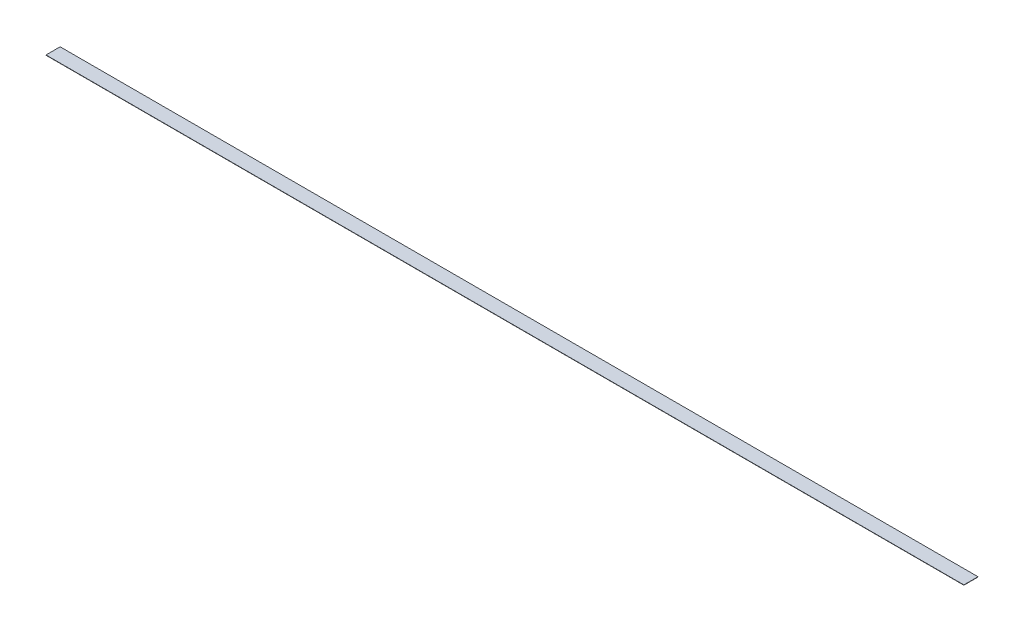
ISO-10303-21;
HEADER;
FILE_DESCRIPTION(('STEP AP214'),'2;1');
FILE_NAME('part.step','',(''),(''),'','','');
FILE_SCHEMA(('AUTOMOTIVE_DESIGN { 1 0 10303 214 1 1 1 1 }'));
ENDSEC;
DATA;
#1=APPLICATION_CONTEXT('core data for automotive mechanical design processes');
#2=APPLICATION_PROTOCOL_DEFINITION('international standard','automotive_design',2000,#1);
#3=PRODUCT_CONTEXT('',#1,'mechanical');
#4=PRODUCT('Part','Part','',(#3));
#5=PRODUCT_RELATED_PRODUCT_CATEGORY('part','',(#4));
#6=PRODUCT_DEFINITION_FORMATION('','',#4);
#7=PRODUCT_DEFINITION_CONTEXT('part definition',#1,'design');
#8=PRODUCT_DEFINITION('design','',#6,#7);
#9=PRODUCT_DEFINITION_SHAPE('','',#8);
#10=(LENGTH_UNIT() NAMED_UNIT(*) SI_UNIT(.MILLI.,.METRE.));
#11=(NAMED_UNIT(*) PLANE_ANGLE_UNIT() SI_UNIT($,.RADIAN.));
#12=(NAMED_UNIT(*) SI_UNIT($,.STERADIAN.) SOLID_ANGLE_UNIT());
#13=UNCERTAINTY_MEASURE_WITH_UNIT(LENGTH_MEASURE(1.E-05),#10,'distance_accuracy_value','');
#14=(GEOMETRIC_REPRESENTATION_CONTEXT(3) GLOBAL_UNCERTAINTY_ASSIGNED_CONTEXT((#13)) GLOBAL_UNIT_ASSIGNED_CONTEXT((#10,
#11,#12)) REPRESENTATION_CONTEXT('',''));
#15=CARTESIAN_POINT('',(0.,0.,0.));
#16=DIRECTION('',(0.,0.,1.));
#17=DIRECTION('',(1.,0.,0.));
#18=AXIS2_PLACEMENT_3D('',#15,#16,#17);
#19=CARTESIAN_POINT('',(206.3115,0.0635,3.175));
#20=DIRECTION('',(-1.,0.,0.));
#21=DIRECTION('',(0.,0.,1.));
#22=AXIS2_PLACEMENT_3D('',#19,#20,#21);
#23=PLANE('',#22);
#24=DIRECTION('',(0.,1.,0.));
#25=VECTOR('',#24,1.);
#26=CARTESIAN_POINT('',(206.3115,0.0635,0.));
#27=LINE('',#26,#25);
#28=CARTESIAN_POINT('',(206.3115,0.,0.));
#29=VERTEX_POINT('',#28);
#30=CARTESIAN_POINT('',(206.3115,0.0635,0.));
#31=VERTEX_POINT('',#30);
#32=EDGE_CURVE('E99',#29,#31,#27,.T.);
#33=ORIENTED_EDGE('',*,*,#32,.T.);
#34=DIRECTION('',(0.,0.,-1.));
#35=VECTOR('',#34,1.);
#36=CARTESIAN_POINT('',(206.3115,0.0635,3.175));
#37=LINE('',#36,#35);
#38=CARTESIAN_POINT('',(206.3115,0.0635,3.175));
#39=VERTEX_POINT('',#38);
#40=EDGE_CURVE('E11',#39,#31,#37,.T.);
#41=ORIENTED_EDGE('',*,*,#40,.F.);
#42=DIRECTION('',(0.,1.,0.));
#43=VECTOR('',#42,1.);
#44=CARTESIAN_POINT('',(206.3115,0.0635,3.175));
#45=LINE('',#44,#43);
#46=CARTESIAN_POINT('',(206.3115,0.,3.175));
#47=VERTEX_POINT('',#46);
#48=EDGE_CURVE('E87',#47,#39,#45,.T.);
#49=ORIENTED_EDGE('',*,*,#48,.F.);
#50=DIRECTION('',(0.,0.,-1.));
#51=VECTOR('',#50,1.);
#52=CARTESIAN_POINT('',(206.3115,0.,3.175));
#53=LINE('',#52,#51);
#54=EDGE_CURVE('E95',#47,#29,#53,.T.);
#55=ORIENTED_EDGE('',*,*,#54,.T.);
#56=EDGE_LOOP('',(#33,#41,#49,#55));
#57=FACE_BOUND('',#56,.T.);
#58=ADVANCED_FACE('F36',(#57),#23,.F.);
#59=CARTESIAN_POINT('',(0.0634999999999957,0.0635,3.175));
#60=DIRECTION('',(0.,-1.,0.));
#61=DIRECTION('',(0.,0.,-1.));
#62=AXIS2_PLACEMENT_3D('',#59,#60,#61);
#63=PLANE('',#62);
#64=DIRECTION('',(-1.,0.,0.));
#65=VECTOR('',#64,1.);
#66=CARTESIAN_POINT('',(0.0634999999999957,0.0635,0.));
#67=LINE('',#66,#65);
#68=CARTESIAN_POINT('',(0.0634999999999957,0.0635,0.));
#69=VERTEX_POINT('',#68);
#70=EDGE_CURVE('E91',#31,#69,#67,.T.);
#71=ORIENTED_EDGE('',*,*,#70,.T.);
#72=DIRECTION('',(0.,0.,-1.));
#73=VECTOR('',#72,1.);
#74=CARTESIAN_POINT('',(0.0634999999999957,0.0635,3.175));
#75=LINE('',#74,#73);
#76=CARTESIAN_POINT('',(0.0634999999999957,0.0635,3.175));
#77=VERTEX_POINT('',#76);
#78=EDGE_CURVE('E44',#77,#69,#75,.T.);
#79=ORIENTED_EDGE('',*,*,#78,.F.);
#80=DIRECTION('',(-1.,0.,0.));
#81=VECTOR('',#80,1.);
#82=CARTESIAN_POINT('',(0.0634999999999957,0.0635,3.175));
#83=LINE('',#82,#81);
#84=EDGE_CURVE('E82',#39,#77,#83,.T.);
#85=ORIENTED_EDGE('',*,*,#84,.F.);
#86=ORIENTED_EDGE('',*,*,#40,.T.);
#87=EDGE_LOOP('',(#71,#79,#85,#86));
#88=FACE_BOUND('',#87,.T.);
#89=ADVANCED_FACE('F90',(#88),#63,.F.);
#90=CARTESIAN_POINT('',(0.0634999999999957,0.0635,3.175));
#91=DIRECTION('',(1.,0.,0.));
#92=DIRECTION('',(0.,0.,-1.));
#93=AXIS2_PLACEMENT_3D('',#90,#91,#92);
#94=PLANE('',#93);
#95=DIRECTION('',(0.,-1.,0.));
#96=VECTOR('',#95,1.);
#97=CARTESIAN_POINT('',(0.0634999999999957,0.0635,0.));
#98=LINE('',#97,#96);
#99=CARTESIAN_POINT('',(0.0634999999999957,0.,0.));
#100=VERTEX_POINT('',#99);
#101=EDGE_CURVE('E69',#69,#100,#98,.T.);
#102=ORIENTED_EDGE('',*,*,#101,.T.);
#103=DIRECTION('',(0.,0.,-1.));
#104=VECTOR('',#103,1.);
#105=CARTESIAN_POINT('',(0.0634999999999957,0.,3.175));
#106=LINE('',#105,#104);
#107=CARTESIAN_POINT('',(0.0634999999999957,0.,3.175));
#108=VERTEX_POINT('',#107);
#109=EDGE_CURVE('E92',#108,#100,#106,.T.);
#110=ORIENTED_EDGE('',*,*,#109,.F.);
#111=DIRECTION('',(0.,-1.,0.));
#112=VECTOR('',#111,1.);
#113=CARTESIAN_POINT('',(0.0634999999999957,0.0635,3.175));
#114=LINE('',#113,#112);
#115=EDGE_CURVE('E85',#77,#108,#114,.T.);
#116=ORIENTED_EDGE('',*,*,#115,.F.);
#117=ORIENTED_EDGE('',*,*,#78,.T.);
#118=EDGE_LOOP('',(#102,#110,#116,#117));
#119=FACE_BOUND('',#118,.T.);
#120=ADVANCED_FACE('F93',(#119),#94,.F.);
#121=CARTESIAN_POINT('',(0.0634999999999957,0.,3.175));
#122=DIRECTION('',(0.,1.,0.));
#123=DIRECTION('',(0.,0.,1.));
#124=AXIS2_PLACEMENT_3D('',#121,#122,#123);
#125=PLANE('',#124);
#126=DIRECTION('',(1.,0.,0.));
#127=VECTOR('',#126,1.);
#128=CARTESIAN_POINT('',(0.0634999999999957,0.,0.));
#129=LINE('',#128,#127);
#130=EDGE_CURVE('E75',#100,#29,#129,.T.);
#131=ORIENTED_EDGE('',*,*,#130,.T.);
#132=ORIENTED_EDGE('',*,*,#54,.F.);
#133=DIRECTION('',(1.,0.,0.));
#134=VECTOR('',#133,1.);
#135=CARTESIAN_POINT('',(0.0634999999999957,0.,3.175));
#136=LINE('',#135,#134);
#137=EDGE_CURVE('E52',#108,#47,#136,.T.);
#138=ORIENTED_EDGE('',*,*,#137,.F.);
#139=ORIENTED_EDGE('',*,*,#109,.T.);
#140=EDGE_LOOP('',(#131,#132,#138,#139));
#141=FACE_BOUND('',#140,.T.);
#142=ADVANCED_FACE('F106',(#141),#125,.F.);
#143=CARTESIAN_POINT('',(0.,0.,3.175));
#144=DIRECTION('',(0.,0.,1.));
#145=DIRECTION('',(1.,0.,0.));
#146=AXIS2_PLACEMENT_3D('',#143,#144,#145);
#147=PLANE('',#146);
#148=ORIENTED_EDGE('',*,*,#48,.T.);
#149=ORIENTED_EDGE('',*,*,#84,.T.);
#150=ORIENTED_EDGE('',*,*,#115,.T.);
#151=ORIENTED_EDGE('',*,*,#137,.T.);
#152=EDGE_LOOP('',(#148,#149,#150,#151));
#153=FACE_BOUND('',#152,.T.);
#154=ADVANCED_FACE('F83',(#153),#147,.T.);
#155=CARTESIAN_POINT('',(0.,0.,0.));
#156=DIRECTION('',(0.,0.,1.));
#157=DIRECTION('',(1.,0.,0.));
#158=AXIS2_PLACEMENT_3D('',#155,#156,#157);
#159=PLANE('',#158);
#160=ORIENTED_EDGE('',*,*,#32,.F.);
#161=ORIENTED_EDGE('',*,*,#130,.F.);
#162=ORIENTED_EDGE('',*,*,#101,.F.);
#163=ORIENTED_EDGE('',*,*,#70,.F.);
#164=EDGE_LOOP('',(#160,#161,#162,#163));
#165=FACE_BOUND('',#164,.T.);
#166=ADVANCED_FACE('F109',(#165),#159,.F.);
#167=CLOSED_SHELL('',(#58,#89,#120,#142,#154,#166));
#168=MANIFOLD_SOLID_BREP('B2',#167);
#169=ADVANCED_BREP_SHAPE_REPRESENTATION('',(#18,#168),#14);
#170=SHAPE_DEFINITION_REPRESENTATION(#9,#169);
ENDSEC;
END-ISO-10303-21;
